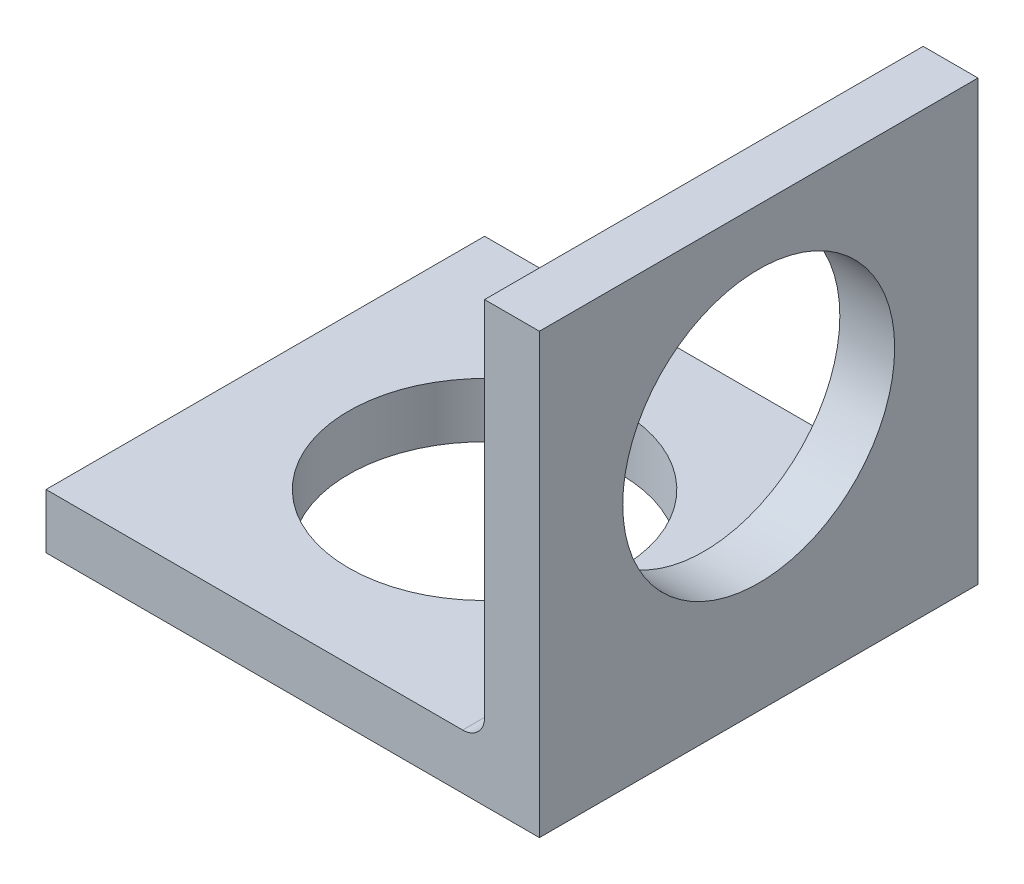
ISO-10303-21;
HEADER;
FILE_DESCRIPTION(('STEP AP214'),'2;1');
FILE_NAME('part.step','',(''),(''),'','','');
FILE_SCHEMA(('AUTOMOTIVE_DESIGN { 1 0 10303 214 1 1 1 1 }'));
ENDSEC;
DATA;
#1=APPLICATION_CONTEXT('core data for automotive mechanical design processes');
#2=APPLICATION_PROTOCOL_DEFINITION('international standard','automotive_design',2000,#1);
#3=PRODUCT_CONTEXT('',#1,'mechanical');
#4=PRODUCT('Part','Part','',(#3));
#5=PRODUCT_RELATED_PRODUCT_CATEGORY('part','',(#4));
#6=PRODUCT_DEFINITION_FORMATION('','',#4);
#7=PRODUCT_DEFINITION_CONTEXT('part definition',#1,'design');
#8=PRODUCT_DEFINITION('design','',#6,#7);
#9=PRODUCT_DEFINITION_SHAPE('','',#8);
#10=(LENGTH_UNIT() NAMED_UNIT(*) SI_UNIT(.MILLI.,.METRE.));
#11=(NAMED_UNIT(*) PLANE_ANGLE_UNIT() SI_UNIT($,.RADIAN.));
#12=(NAMED_UNIT(*) SI_UNIT($,.STERADIAN.) SOLID_ANGLE_UNIT());
#13=UNCERTAINTY_MEASURE_WITH_UNIT(LENGTH_MEASURE(1.E-05),#10,'distance_accuracy_value','');
#14=(GEOMETRIC_REPRESENTATION_CONTEXT(3) GLOBAL_UNCERTAINTY_ASSIGNED_CONTEXT((#13)) GLOBAL_UNIT_ASSIGNED_CONTEXT((#10,
#11,#12)) REPRESENTATION_CONTEXT('',''));
#15=CARTESIAN_POINT('',(0.,0.,0.));
#16=DIRECTION('',(0.,0.,1.));
#17=DIRECTION('',(1.,0.,0.));
#18=AXIS2_PLACEMENT_3D('',#15,#16,#17);
#19=CARTESIAN_POINT('',(12.065,2.2225,12.7));
#20=DIRECTION('',(0.,0.,-1.));
#21=DIRECTION('',(-1.,0.,0.));
#22=AXIS2_PLACEMENT_3D('',#19,#20,#21);
#23=CYLINDRICAL_SURFACE('',#22,0.635);
#24=DIRECTION('',(0.,0.,1.));
#25=VECTOR('',#24,1.);
#26=CARTESIAN_POINT('',(12.7,2.2225,12.7));
#27=LINE('',#26,#25);
#28=CARTESIAN_POINT('',(12.7,2.2225,0.));
#29=VERTEX_POINT('',#28);
#30=CARTESIAN_POINT('',(12.7,2.2225,12.7));
#31=VERTEX_POINT('',#30);
#32=EDGE_CURVE('E128',#29,#31,#27,.T.);
#33=ORIENTED_EDGE('',*,*,#32,.F.);
#34=CARTESIAN_POINT('',(12.065,2.2225,0.));
#35=DIRECTION('',(0.,0.,-1.));
#36=DIRECTION('',(-1.,0.,0.));
#37=AXIS2_PLACEMENT_3D('',#34,#35,#36);
#38=CIRCLE('',#37,0.635);
#39=CARTESIAN_POINT('',(12.065,1.5875,0.));
#40=VERTEX_POINT('',#39);
#41=EDGE_CURVE('E53',#29,#40,#38,.T.);
#42=ORIENTED_EDGE('',*,*,#41,.T.);
#43=DIRECTION('',(0.,0.,1.));
#44=VECTOR('',#43,1.);
#45=CARTESIAN_POINT('',(12.065,1.5875,12.7));
#46=LINE('',#45,#44);
#47=CARTESIAN_POINT('',(12.065,1.5875,12.7));
#48=VERTEX_POINT('',#47);
#49=EDGE_CURVE('E133',#48,#40,#46,.F.);
#50=ORIENTED_EDGE('',*,*,#49,.F.);
#51=CARTESIAN_POINT('',(12.065,2.2225,12.7));
#52=DIRECTION('',(0.,0.,-1.));
#53=DIRECTION('',(-1.,0.,0.));
#54=AXIS2_PLACEMENT_3D('',#51,#52,#53);
#55=CIRCLE('',#54,0.635);
#56=EDGE_CURVE('E11',#48,#31,#55,.F.);
#57=ORIENTED_EDGE('',*,*,#56,.T.);
#58=EDGE_LOOP('',(#33,#42,#50,#57));
#59=FACE_BOUND('',#58,.T.);
#60=ADVANCED_FACE('F45',(#59),#23,.F.);
#61=CARTESIAN_POINT('',(0.,0.,12.7));
#62=DIRECTION('',(1.,0.,0.));
#63=DIRECTION('',(0.,0.,-1.));
#64=AXIS2_PLACEMENT_3D('',#61,#62,#63);
#65=PLANE('',#64);
#66=DIRECTION('',(0.,-1.,0.));
#67=VECTOR('',#66,1.);
#68=CARTESIAN_POINT('',(0.,0.,0.));
#69=LINE('',#68,#67);
#70=CARTESIAN_POINT('',(0.,1.5875,0.));
#71=VERTEX_POINT('',#70);
#72=CARTESIAN_POINT('',(0.,0.,0.));
#73=VERTEX_POINT('',#72);
#74=EDGE_CURVE('E126',#71,#73,#69,.T.);
#75=ORIENTED_EDGE('',*,*,#74,.T.);
#76=DIRECTION('',(0.,0.,-1.));
#77=VECTOR('',#76,1.);
#78=CARTESIAN_POINT('',(0.,0.,12.7));
#79=LINE('',#78,#77);
#80=CARTESIAN_POINT('',(0.,0.,12.7));
#81=VERTEX_POINT('',#80);
#82=EDGE_CURVE('E105',#81,#73,#79,.T.);
#83=ORIENTED_EDGE('',*,*,#82,.F.);
#84=DIRECTION('',(0.,-1.,0.));
#85=VECTOR('',#84,1.);
#86=CARTESIAN_POINT('',(0.,0.,12.7));
#87=LINE('',#86,#85);
#88=CARTESIAN_POINT('',(0.,1.5875,12.7));
#89=VERTEX_POINT('',#88);
#90=EDGE_CURVE('E112',#89,#81,#87,.T.);
#91=ORIENTED_EDGE('',*,*,#90,.F.);
#92=DIRECTION('',(0.,0.,-1.));
#93=VECTOR('',#92,1.);
#94=CARTESIAN_POINT('',(0.,1.5875,12.7));
#95=LINE('',#94,#93);
#96=EDGE_CURVE('E156',#89,#71,#95,.T.);
#97=ORIENTED_EDGE('',*,*,#96,.T.);
#98=EDGE_LOOP('',(#75,#83,#91,#97));
#99=FACE_BOUND('',#98,.T.);
#100=ADVANCED_FACE('F124',(#99),#65,.F.);
#101=CARTESIAN_POINT('',(0.,0.,12.7));
#102=DIRECTION('',(0.,1.,0.));
#103=DIRECTION('',(0.,0.,1.));
#104=AXIS2_PLACEMENT_3D('',#101,#102,#103);
#105=PLANE('',#104);
#106=CARTESIAN_POINT('',(6.35,0.,6.35));
#107=DIRECTION('',(0.,1.,0.));
#108=DIRECTION('',(0.,0.,1.));
#109=AXIS2_PLACEMENT_3D('',#106,#107,#108);
#110=CIRCLE('',#109,3.937);
#111=CARTESIAN_POINT('',(6.35,0.,10.287));
#112=VERTEX_POINT('',#111);
#113=EDGE_CURVE('E200',#112,#112,#110,.T.);
#114=ORIENTED_EDGE('',*,*,#113,.T.);
#115=EDGE_LOOP('',(#114));
#116=FACE_BOUND('',#115,.T.);
#117=DIRECTION('',(1.,0.,0.));
#118=VECTOR('',#117,1.);
#119=CARTESIAN_POINT('',(0.,0.,0.));
#120=LINE('',#119,#118);
#121=CARTESIAN_POINT('',(14.2875,0.,0.));
#122=VERTEX_POINT('',#121);
#123=EDGE_CURVE('E176',#73,#122,#120,.T.);
#124=ORIENTED_EDGE('',*,*,#123,.T.);
#125=DIRECTION('',(0.,0.,-1.));
#126=VECTOR('',#125,1.);
#127=CARTESIAN_POINT('',(14.2875,0.,12.7));
#128=LINE('',#127,#126);
#129=CARTESIAN_POINT('',(14.2875,0.,12.7));
#130=VERTEX_POINT('',#129);
#131=EDGE_CURVE('E108',#130,#122,#128,.T.);
#132=ORIENTED_EDGE('',*,*,#131,.F.);
#133=DIRECTION('',(1.,0.,0.));
#134=VECTOR('',#133,1.);
#135=CARTESIAN_POINT('',(0.,0.,12.7));
#136=LINE('',#135,#134);
#137=EDGE_CURVE('E101',#81,#130,#136,.T.);
#138=ORIENTED_EDGE('',*,*,#137,.F.);
#139=ORIENTED_EDGE('',*,*,#82,.T.);
#140=EDGE_LOOP('',(#124,#132,#138,#139));
#141=FACE_BOUND('',#140,.T.);
#142=ADVANCED_FACE('F103',(#116,#141),#105,.F.);
#143=CARTESIAN_POINT('',(14.2875,0.,12.7));
#144=DIRECTION('',(-1.,0.,0.));
#145=DIRECTION('',(0.,0.,1.));
#146=AXIS2_PLACEMENT_3D('',#143,#144,#145);
#147=PLANE('',#146);
#148=CARTESIAN_POINT('',(14.2875,7.14375,6.35));
#149=DIRECTION('',(-1.,0.,0.));
#150=DIRECTION('',(0.,0.,1.));
#151=AXIS2_PLACEMENT_3D('',#148,#149,#150);
#152=CIRCLE('',#151,3.937);
#153=CARTESIAN_POINT('',(14.2875,7.14375,10.287));
#154=VERTEX_POINT('',#153);
#155=EDGE_CURVE('E183',#154,#154,#152,.T.);
#156=ORIENTED_EDGE('',*,*,#155,.T.);
#157=EDGE_LOOP('',(#156));
#158=FACE_BOUND('',#157,.T.);
#159=DIRECTION('',(0.,1.,0.));
#160=VECTOR('',#159,1.);
#161=CARTESIAN_POINT('',(14.2875,0.,0.));
#162=LINE('',#161,#160);
#163=CARTESIAN_POINT('',(14.2875,12.7,0.));
#164=VERTEX_POINT('',#163);
#165=EDGE_CURVE('E173',#122,#164,#162,.T.);
#166=ORIENTED_EDGE('',*,*,#165,.T.);
#167=DIRECTION('',(0.,0.,-1.));
#168=VECTOR('',#167,1.);
#169=CARTESIAN_POINT('',(14.2875,12.7,12.7));
#170=LINE('',#169,#168);
#171=CARTESIAN_POINT('',(14.2875,12.7,12.7));
#172=VERTEX_POINT('',#171);
#173=EDGE_CURVE('E135',#172,#164,#170,.T.);
#174=ORIENTED_EDGE('',*,*,#173,.F.);
#175=DIRECTION('',(0.,1.,0.));
#176=VECTOR('',#175,1.);
#177=CARTESIAN_POINT('',(14.2875,0.,12.7));
#178=LINE('',#177,#176);
#179=EDGE_CURVE('E111',#130,#172,#178,.T.);
#180=ORIENTED_EDGE('',*,*,#179,.F.);
#181=ORIENTED_EDGE('',*,*,#131,.T.);
#182=EDGE_LOOP('',(#166,#174,#180,#181));
#183=FACE_BOUND('',#182,.T.);
#184=ADVANCED_FACE('F230',(#158,#183),#147,.F.);
#185=CARTESIAN_POINT('',(12.7,12.7,12.7));
#186=DIRECTION('',(0.,-1.,0.));
#187=DIRECTION('',(0.,0.,-1.));
#188=AXIS2_PLACEMENT_3D('',#185,#186,#187);
#189=PLANE('',#188);
#190=DIRECTION('',(-1.,0.,0.));
#191=VECTOR('',#190,1.);
#192=CARTESIAN_POINT('',(12.7,12.7,0.));
#193=LINE('',#192,#191);
#194=CARTESIAN_POINT('',(12.7,12.7,0.));
#195=VERTEX_POINT('',#194);
#196=EDGE_CURVE('E152',#164,#195,#193,.T.);
#197=ORIENTED_EDGE('',*,*,#196,.T.);
#198=DIRECTION('',(0.,0.,-1.));
#199=VECTOR('',#198,1.);
#200=CARTESIAN_POINT('',(12.7,12.7,12.7));
#201=LINE('',#200,#199);
#202=CARTESIAN_POINT('',(12.7,12.7,12.7));
#203=VERTEX_POINT('',#202);
#204=EDGE_CURVE('E159',#203,#195,#201,.T.);
#205=ORIENTED_EDGE('',*,*,#204,.F.);
#206=DIRECTION('',(-1.,0.,0.));
#207=VECTOR('',#206,1.);
#208=CARTESIAN_POINT('',(12.7,12.7,12.7));
#209=LINE('',#208,#207);
#210=EDGE_CURVE('E170',#172,#203,#209,.T.);
#211=ORIENTED_EDGE('',*,*,#210,.F.);
#212=ORIENTED_EDGE('',*,*,#173,.T.);
#213=EDGE_LOOP('',(#197,#205,#211,#212));
#214=FACE_BOUND('',#213,.T.);
#215=ADVANCED_FACE('F168',(#214),#189,.F.);
#216=CARTESIAN_POINT('',(12.7,1.5875,12.7));
#217=DIRECTION('',(1.,0.,0.));
#218=DIRECTION('',(0.,0.,-1.));
#219=AXIS2_PLACEMENT_3D('',#216,#217,#218);
#220=PLANE('',#219);
#221=CARTESIAN_POINT('',(12.7,7.14375,6.35));
#222=DIRECTION('',(-1.,0.,0.));
#223=DIRECTION('',(0.,0.,1.));
#224=AXIS2_PLACEMENT_3D('',#221,#222,#223);
#225=CIRCLE('',#224,3.937);
#226=CARTESIAN_POINT('',(12.7,7.14375,10.287));
#227=VERTEX_POINT('',#226);
#228=EDGE_CURVE('E196',#227,#227,#225,.T.);
#229=ORIENTED_EDGE('',*,*,#228,.F.);
#230=EDGE_LOOP('',(#229));
#231=FACE_BOUND('',#230,.T.);
#232=DIRECTION('',(0.,-1.,0.));
#233=VECTOR('',#232,1.);
#234=CARTESIAN_POINT('',(12.7,1.5875,0.));
#235=LINE('',#234,#233);
#236=EDGE_CURVE('E148',#195,#29,#235,.T.);
#237=ORIENTED_EDGE('',*,*,#236,.T.);
#238=ORIENTED_EDGE('',*,*,#32,.T.);
#239=DIRECTION('',(0.,-1.,0.));
#240=VECTOR('',#239,1.);
#241=CARTESIAN_POINT('',(12.7,1.5875,12.7));
#242=LINE('',#241,#240);
#243=EDGE_CURVE('E186',#203,#31,#242,.T.);
#244=ORIENTED_EDGE('',*,*,#243,.F.);
#245=ORIENTED_EDGE('',*,*,#204,.T.);
#246=EDGE_LOOP('',(#237,#238,#244,#245));
#247=FACE_BOUND('',#246,.T.);
#248=ADVANCED_FACE('F213',(#231,#247),#220,.F.);
#249=CARTESIAN_POINT('',(0.,1.5875,12.7));
#250=DIRECTION('',(0.,-1.,0.));
#251=DIRECTION('',(0.,0.,-1.));
#252=AXIS2_PLACEMENT_3D('',#249,#250,#251);
#253=PLANE('',#252);
#254=CARTESIAN_POINT('',(6.35,1.5875,6.35));
#255=DIRECTION('',(0.,1.,0.));
#256=DIRECTION('',(0.,0.,1.));
#257=AXIS2_PLACEMENT_3D('',#254,#255,#256);
#258=CIRCLE('',#257,3.937);
#259=CARTESIAN_POINT('',(6.35,1.5875,10.287));
#260=VERTEX_POINT('',#259);
#261=EDGE_CURVE('E204',#260,#260,#258,.T.);
#262=ORIENTED_EDGE('',*,*,#261,.F.);
#263=EDGE_LOOP('',(#262));
#264=FACE_BOUND('',#263,.T.);
#265=DIRECTION('',(-1.,0.,0.));
#266=VECTOR('',#265,1.);
#267=CARTESIAN_POINT('',(0.,1.5875,12.7));
#268=LINE('',#267,#266);
#269=EDGE_CURVE('E117',#48,#89,#268,.T.);
#270=ORIENTED_EDGE('',*,*,#269,.F.);
#271=ORIENTED_EDGE('',*,*,#49,.T.);
#272=DIRECTION('',(-1.,0.,0.));
#273=VECTOR('',#272,1.);
#274=CARTESIAN_POINT('',(0.,1.5875,0.));
#275=LINE('',#274,#273);
#276=EDGE_CURVE('E122',#40,#71,#275,.T.);
#277=ORIENTED_EDGE('',*,*,#276,.T.);
#278=ORIENTED_EDGE('',*,*,#96,.F.);
#279=EDGE_LOOP('',(#270,#271,#277,#278));
#280=FACE_BOUND('',#279,.T.);
#281=ADVANCED_FACE('F143',(#264,#280),#253,.F.);
#282=CARTESIAN_POINT('',(0.,0.,12.7));
#283=DIRECTION('',(0.,0.,-1.));
#284=DIRECTION('',(-1.,0.,0.));
#285=AXIS2_PLACEMENT_3D('',#282,#283,#284);
#286=PLANE('',#285);
#287=ORIENTED_EDGE('',*,*,#56,.F.);
#288=ORIENTED_EDGE('',*,*,#269,.T.);
#289=ORIENTED_EDGE('',*,*,#90,.T.);
#290=ORIENTED_EDGE('',*,*,#137,.T.);
#291=ORIENTED_EDGE('',*,*,#179,.T.);
#292=ORIENTED_EDGE('',*,*,#210,.T.);
#293=ORIENTED_EDGE('',*,*,#243,.T.);
#294=EDGE_LOOP('',(#287,#288,#289,#290,#291,#292,#293));
#295=FACE_BOUND('',#294,.T.);
#296=ADVANCED_FACE('F115',(#295),#286,.F.);
#297=CARTESIAN_POINT('',(0.,0.,0.));
#298=DIRECTION('',(0.,0.,-1.));
#299=DIRECTION('',(-1.,0.,0.));
#300=AXIS2_PLACEMENT_3D('',#297,#298,#299);
#301=PLANE('',#300);
#302=ORIENTED_EDGE('',*,*,#74,.F.);
#303=ORIENTED_EDGE('',*,*,#276,.F.);
#304=ORIENTED_EDGE('',*,*,#41,.F.);
#305=ORIENTED_EDGE('',*,*,#236,.F.);
#306=ORIENTED_EDGE('',*,*,#196,.F.);
#307=ORIENTED_EDGE('',*,*,#165,.F.);
#308=ORIENTED_EDGE('',*,*,#123,.F.);
#309=EDGE_LOOP('',(#302,#303,#304,#305,#306,#307,#308));
#310=FACE_BOUND('',#309,.T.);
#311=ADVANCED_FACE('F145',(#310),#301,.T.);
#312=CARTESIAN_POINT('',(19.05,7.14375,6.35));
#313=DIRECTION('',(-1.,0.,0.));
#314=DIRECTION('',(0.,0.,1.));
#315=AXIS2_PLACEMENT_3D('',#312,#313,#314);
#316=CYLINDRICAL_SURFACE('',#315,3.937);
#317=ORIENTED_EDGE('',*,*,#228,.T.);
#318=EDGE_LOOP('',(#317));
#319=FACE_BOUND('',#318,.T.);
#320=ORIENTED_EDGE('',*,*,#155,.F.);
#321=EDGE_LOOP('',(#320));
#322=FACE_BOUND('',#321,.T.);
#323=ADVANCED_FACE('F244',(#319,#322),#316,.F.);
#324=CARTESIAN_POINT('',(6.35,-4.7625,6.35));
#325=DIRECTION('',(0.,1.,0.));
#326=DIRECTION('',(0.,0.,1.));
#327=AXIS2_PLACEMENT_3D('',#324,#325,#326);
#328=CYLINDRICAL_SURFACE('',#327,3.937);
#329=ORIENTED_EDGE('',*,*,#261,.T.);
#330=EDGE_LOOP('',(#329));
#331=FACE_BOUND('',#330,.T.);
#332=ORIENTED_EDGE('',*,*,#113,.F.);
#333=EDGE_LOOP('',(#332));
#334=FACE_BOUND('',#333,.T.);
#335=ADVANCED_FACE('F209',(#331,#334),#328,.F.);
#336=CLOSED_SHELL('',(#60,#100,#142,#184,#215,#248,#281,#296,#311,#323,#335));
#337=MANIFOLD_SOLID_BREP('B2',#336);
#338=ADVANCED_BREP_SHAPE_REPRESENTATION('',(#18,#337),#14);
#339=SHAPE_DEFINITION_REPRESENTATION(#9,#338);
ENDSEC;
END-ISO-10303-21;
